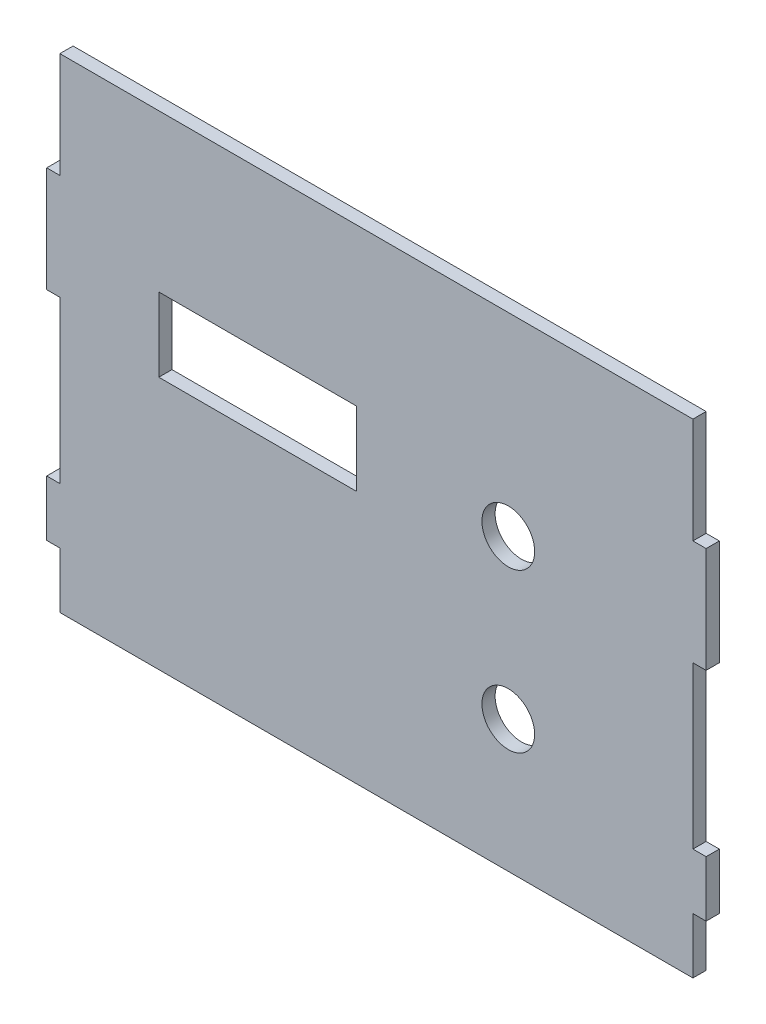
ISO-10303-21;
HEADER;
FILE_DESCRIPTION(('STEP AP214'),'2;1');
FILE_NAME('part.step','',(''),(''),'','','');
FILE_SCHEMA(('AUTOMOTIVE_DESIGN { 1 0 10303 214 1 1 1 1 }'));
ENDSEC;
DATA;
#1=APPLICATION_CONTEXT('core data for automotive mechanical design processes');
#2=APPLICATION_PROTOCOL_DEFINITION('international standard','automotive_design',2000,#1);
#3=PRODUCT_CONTEXT('',#1,'mechanical');
#4=PRODUCT('Part','Part','',(#3));
#5=PRODUCT_RELATED_PRODUCT_CATEGORY('part','',(#4));
#6=PRODUCT_DEFINITION_FORMATION('','',#4);
#7=PRODUCT_DEFINITION_CONTEXT('part definition',#1,'design');
#8=PRODUCT_DEFINITION('design','',#6,#7);
#9=PRODUCT_DEFINITION_SHAPE('','',#8);
#10=(LENGTH_UNIT() NAMED_UNIT(*) SI_UNIT(.MILLI.,.METRE.));
#11=(NAMED_UNIT(*) PLANE_ANGLE_UNIT() SI_UNIT($,.RADIAN.));
#12=(NAMED_UNIT(*) SI_UNIT($,.STERADIAN.) SOLID_ANGLE_UNIT());
#13=UNCERTAINTY_MEASURE_WITH_UNIT(LENGTH_MEASURE(1.E-05),#10,'distance_accuracy_value','');
#14=(GEOMETRIC_REPRESENTATION_CONTEXT(3) GLOBAL_UNCERTAINTY_ASSIGNED_CONTEXT((#13)) GLOBAL_UNIT_ASSIGNED_CONTEXT((#10,
#11,#12)) REPRESENTATION_CONTEXT('',''));
#15=CARTESIAN_POINT('',(0.,0.,0.));
#16=DIRECTION('',(0.,0.,1.));
#17=DIRECTION('',(1.,0.,0.));
#18=AXIS2_PLACEMENT_3D('',#15,#16,#17);
#19=CARTESIAN_POINT('',(0.,0.,5.));
#20=DIRECTION('',(0.,0.,1.));
#21=DIRECTION('',(1.,0.,0.));
#22=AXIS2_PLACEMENT_3D('',#19,#20,#21);
#23=PLANE('',#22);
#24=CARTESIAN_POINT('',(170.,110.,5.));
#25=DIRECTION('',(0.,0.,1.));
#26=DIRECTION('',(1.,0.,0.));
#27=AXIS2_PLACEMENT_3D('',#24,#25,#26);
#28=CIRCLE('',#27,10.);
#29=CARTESIAN_POINT('',(180.,110.,5.));
#30=VERTEX_POINT('',#29);
#31=EDGE_CURVE('E235',#30,#30,#28,.T.);
#32=ORIENTED_EDGE('',*,*,#31,.F.);
#33=EDGE_LOOP('',(#32));
#34=FACE_BOUND('',#33,.T.);
#35=DIRECTION('',(0.,-1.,0.));
#36=VECTOR('',#35,1.);
#37=CARTESIAN_POINT('',(0.,0.,5.));
#38=LINE('',#37,#36);
#39=CARTESIAN_POINT('',(0.,21.1666666666667,5.));
#40=VERTEX_POINT('',#39);
#41=CARTESIAN_POINT('',(0.,0.,5.));
#42=VERTEX_POINT('',#41);
#43=EDGE_CURVE('E251',#40,#42,#38,.T.);
#44=ORIENTED_EDGE('',*,*,#43,.T.);
#45=DIRECTION('',(1.,0.,0.));
#46=VECTOR('',#45,1.);
#47=CARTESIAN_POINT('',(0.,0.,5.));
#48=LINE('',#47,#46);
#49=CARTESIAN_POINT('',(240.,0.,5.));
#50=VERTEX_POINT('',#49);
#51=EDGE_CURVE('E255',#42,#50,#48,.T.);
#52=ORIENTED_EDGE('',*,*,#51,.T.);
#53=DIRECTION('',(0.,1.,0.));
#54=VECTOR('',#53,1.);
#55=CARTESIAN_POINT('',(240.,0.,5.));
#56=LINE('',#55,#54);
#57=CARTESIAN_POINT('',(240.,21.1666666666667,5.));
#58=VERTEX_POINT('',#57);
#59=EDGE_CURVE('E259',#50,#58,#56,.T.);
#60=ORIENTED_EDGE('',*,*,#59,.T.);
#61=DIRECTION('',(1.,0.,0.));
#62=VECTOR('',#61,1.);
#63=CARTESIAN_POINT('',(240.,21.1666666666667,5.));
#64=LINE('',#63,#62);
#65=CARTESIAN_POINT('',(245.,21.1666666666667,5.));
#66=VERTEX_POINT('',#65);
#67=EDGE_CURVE('E262',#58,#66,#64,.T.);
#68=ORIENTED_EDGE('',*,*,#67,.T.);
#69=DIRECTION('',(0.,1.,0.));
#70=VECTOR('',#69,1.);
#71=CARTESIAN_POINT('',(245.,42.3333333333334,5.));
#72=LINE('',#71,#70);
#73=CARTESIAN_POINT('',(245.,42.3333333333334,5.));
#74=VERTEX_POINT('',#73);
#75=EDGE_CURVE('E265',#66,#74,#72,.T.);
#76=ORIENTED_EDGE('',*,*,#75,.T.);
#77=DIRECTION('',(-1.,0.,0.));
#78=VECTOR('',#77,1.);
#79=CARTESIAN_POINT('',(240.,42.3333333333334,5.));
#80=LINE('',#79,#78);
#81=CARTESIAN_POINT('',(240.,42.3333333333334,5.));
#82=VERTEX_POINT('',#81);
#83=EDGE_CURVE('E268',#74,#82,#80,.T.);
#84=ORIENTED_EDGE('',*,*,#83,.T.);
#85=DIRECTION('',(0.,1.,0.));
#86=VECTOR('',#85,1.);
#87=CARTESIAN_POINT('',(240.,42.3333333333334,5.));
#88=LINE('',#87,#86);
#89=CARTESIAN_POINT('',(240.,103.5,5.));
#90=VERTEX_POINT('',#89);
#91=EDGE_CURVE('E271',#82,#90,#88,.T.);
#92=ORIENTED_EDGE('',*,*,#91,.T.);
#93=DIRECTION('',(1.,0.,0.));
#94=VECTOR('',#93,1.);
#95=CARTESIAN_POINT('',(240.,103.5,5.));
#96=LINE('',#95,#94);
#97=CARTESIAN_POINT('',(245.,103.5,5.));
#98=VERTEX_POINT('',#97);
#99=EDGE_CURVE('E274',#90,#98,#96,.T.);
#100=ORIENTED_EDGE('',*,*,#99,.T.);
#101=DIRECTION('',(0.,1.,0.));
#102=VECTOR('',#101,1.);
#103=CARTESIAN_POINT('',(245.,143.5,5.));
#104=LINE('',#103,#102);
#105=CARTESIAN_POINT('',(245.,143.5,5.));
#106=VERTEX_POINT('',#105);
#107=EDGE_CURVE('E277',#98,#106,#104,.T.);
#108=ORIENTED_EDGE('',*,*,#107,.T.);
#109=DIRECTION('',(-1.,0.,0.));
#110=VECTOR('',#109,1.);
#111=CARTESIAN_POINT('',(240.,143.5,5.));
#112=LINE('',#111,#110);
#113=CARTESIAN_POINT('',(240.,143.5,5.));
#114=VERTEX_POINT('',#113);
#115=EDGE_CURVE('E280',#106,#114,#112,.T.);
#116=ORIENTED_EDGE('',*,*,#115,.T.);
#117=DIRECTION('',(0.,1.,0.));
#118=VECTOR('',#117,1.);
#119=CARTESIAN_POINT('',(240.,143.5,5.));
#120=LINE('',#119,#118);
#121=CARTESIAN_POINT('',(240.,183.5,5.));
#122=VERTEX_POINT('',#121);
#123=EDGE_CURVE('E283',#114,#122,#120,.T.);
#124=ORIENTED_EDGE('',*,*,#123,.T.);
#125=DIRECTION('',(-1.,0.,0.));
#126=VECTOR('',#125,1.);
#127=CARTESIAN_POINT('',(0.,183.5,5.));
#128=LINE('',#127,#126);
#129=CARTESIAN_POINT('',(0.,183.5,5.));
#130=VERTEX_POINT('',#129);
#131=EDGE_CURVE('E286',#122,#130,#128,.T.);
#132=ORIENTED_EDGE('',*,*,#131,.T.);
#133=DIRECTION('',(0.,-1.,0.));
#134=VECTOR('',#133,1.);
#135=CARTESIAN_POINT('',(0.,143.5,5.));
#136=LINE('',#135,#134);
#137=CARTESIAN_POINT('',(0.,143.5,5.));
#138=VERTEX_POINT('',#137);
#139=EDGE_CURVE('E289',#130,#138,#136,.T.);
#140=ORIENTED_EDGE('',*,*,#139,.T.);
#141=DIRECTION('',(-1.,0.,0.));
#142=VECTOR('',#141,1.);
#143=CARTESIAN_POINT('',(0.,143.5,5.));
#144=LINE('',#143,#142);
#145=CARTESIAN_POINT('',(-5.00000000000004,143.5,5.));
#146=VERTEX_POINT('',#145);
#147=EDGE_CURVE('E292',#138,#146,#144,.T.);
#148=ORIENTED_EDGE('',*,*,#147,.T.);
#149=DIRECTION('',(0.,-1.,0.));
#150=VECTOR('',#149,1.);
#151=CARTESIAN_POINT('',(-5.00000000000004,143.5,5.));
#152=LINE('',#151,#150);
#153=CARTESIAN_POINT('',(-5.00000000000003,103.5,5.));
#154=VERTEX_POINT('',#153);
#155=EDGE_CURVE('E295',#146,#154,#152,.T.);
#156=ORIENTED_EDGE('',*,*,#155,.T.);
#157=DIRECTION('',(1.,0.,0.));
#158=VECTOR('',#157,1.);
#159=CARTESIAN_POINT('',(0.,103.5,5.));
#160=LINE('',#159,#158);
#161=CARTESIAN_POINT('',(0.,103.5,5.));
#162=VERTEX_POINT('',#161);
#163=EDGE_CURVE('E298',#154,#162,#160,.T.);
#164=ORIENTED_EDGE('',*,*,#163,.T.);
#165=DIRECTION('',(0.,-1.,0.));
#166=VECTOR('',#165,1.);
#167=CARTESIAN_POINT('',(0.,42.3333333333333,5.));
#168=LINE('',#167,#166);
#169=CARTESIAN_POINT('',(0.,42.3333333333333,5.));
#170=VERTEX_POINT('',#169);
#171=EDGE_CURVE('E301',#162,#170,#168,.T.);
#172=ORIENTED_EDGE('',*,*,#171,.T.);
#173=DIRECTION('',(-1.,0.,0.));
#174=VECTOR('',#173,1.);
#175=CARTESIAN_POINT('',(0.,42.3333333333333,5.));
#176=LINE('',#175,#174);
#177=CARTESIAN_POINT('',(-5.00000000000002,42.3333333333333,5.));
#178=VERTEX_POINT('',#177);
#179=EDGE_CURVE('E304',#170,#178,#176,.T.);
#180=ORIENTED_EDGE('',*,*,#179,.T.);
#181=DIRECTION('',(0.,-1.,0.));
#182=VECTOR('',#181,1.);
#183=CARTESIAN_POINT('',(-5.00000000000002,42.3333333333333,5.));
#184=LINE('',#183,#182);
#185=CARTESIAN_POINT('',(-5.00000000000002,21.1666666666667,5.));
#186=VERTEX_POINT('',#185);
#187=EDGE_CURVE('E307',#178,#186,#184,.T.);
#188=ORIENTED_EDGE('',*,*,#187,.T.);
#189=DIRECTION('',(1.,0.,0.));
#190=VECTOR('',#189,1.);
#191=CARTESIAN_POINT('',(0.,21.1666666666667,5.));
#192=LINE('',#191,#190);
#193=EDGE_CURVE('E310',#186,#40,#192,.T.);
#194=ORIENTED_EDGE('',*,*,#193,.T.);
#195=EDGE_LOOP('',(#44,#52,#60,#68,#76,#84,#92,#100,#108,#116,#124,#132,#140,#148,#156,#164,
#172,#180,#188,#194));
#196=FACE_BOUND('',#195,.T.);
#197=DIRECTION('',(1.,0.,0.));
#198=VECTOR('',#197,1.);
#199=CARTESIAN_POINT('',(37.5,96.,5.));
#200=LINE('',#199,#198);
#201=CARTESIAN_POINT('',(37.5,96.,5.));
#202=VERTEX_POINT('',#201);
#203=CARTESIAN_POINT('',(112.5,96.,5.));
#204=VERTEX_POINT('',#203);
#205=EDGE_CURVE('E209',#202,#204,#200,.T.);
#206=ORIENTED_EDGE('',*,*,#205,.F.);
#207=DIRECTION('',(0.,-1.,0.));
#208=VECTOR('',#207,1.);
#209=CARTESIAN_POINT('',(37.5,124.,5.));
#210=LINE('',#209,#208);
#211=CARTESIAN_POINT('',(37.5,124.,5.));
#212=VERTEX_POINT('',#211);
#213=EDGE_CURVE('E200',#212,#202,#210,.T.);
#214=ORIENTED_EDGE('',*,*,#213,.F.);
#215=DIRECTION('',(-1.,0.,0.));
#216=VECTOR('',#215,1.);
#217=CARTESIAN_POINT('',(37.5,124.,5.));
#218=LINE('',#217,#216);
#219=CARTESIAN_POINT('',(112.5,124.,5.));
#220=VERTEX_POINT('',#219);
#221=EDGE_CURVE('E227',#220,#212,#218,.T.);
#222=ORIENTED_EDGE('',*,*,#221,.F.);
#223=DIRECTION('',(0.,1.,0.));
#224=VECTOR('',#223,1.);
#225=CARTESIAN_POINT('',(112.5,124.,5.));
#226=LINE('',#225,#224);
#227=EDGE_CURVE('E223',#204,#220,#226,.T.);
#228=ORIENTED_EDGE('',*,*,#227,.F.);
#229=EDGE_LOOP('',(#206,#214,#222,#228));
#230=FACE_BOUND('',#229,.T.);
#231=CARTESIAN_POINT('',(170.,50.,5.));
#232=DIRECTION('',(0.,0.,1.));
#233=DIRECTION('',(1.,0.,0.));
#234=AXIS2_PLACEMENT_3D('',#231,#232,#233);
#235=CIRCLE('',#234,10.);
#236=CARTESIAN_POINT('',(180.,50.,5.));
#237=VERTEX_POINT('',#236);
#238=EDGE_CURVE('E780',#237,#237,#235,.T.);
#239=ORIENTED_EDGE('',*,*,#238,.F.);
#240=EDGE_LOOP('',(#239));
#241=FACE_BOUND('',#240,.T.);
#242=ADVANCED_FACE('F38',(#34,#196,#230,#241),#23,.T.);
#243=CARTESIAN_POINT('',(0.,0.,0.));
#244=DIRECTION('',(0.,0.,1.));
#245=DIRECTION('',(1.,0.,0.));
#246=AXIS2_PLACEMENT_3D('',#243,#244,#245);
#247=PLANE('',#246);
#248=DIRECTION('',(0.,-1.,0.));
#249=VECTOR('',#248,1.);
#250=CARTESIAN_POINT('',(0.,0.,0.));
#251=LINE('',#250,#249);
#252=CARTESIAN_POINT('',(0.,21.1666666666667,0.));
#253=VERTEX_POINT('',#252);
#254=CARTESIAN_POINT('',(0.,0.,0.));
#255=VERTEX_POINT('',#254);
#256=EDGE_CURVE('E218',#253,#255,#251,.T.);
#257=ORIENTED_EDGE('',*,*,#256,.F.);
#258=DIRECTION('',(1.,0.,0.));
#259=VECTOR('',#258,1.);
#260=CARTESIAN_POINT('',(0.,21.1666666666667,0.));
#261=LINE('',#260,#259);
#262=CARTESIAN_POINT('',(-5.00000000000002,21.1666666666667,0.));
#263=VERTEX_POINT('',#262);
#264=EDGE_CURVE('E256',#263,#253,#261,.T.);
#265=ORIENTED_EDGE('',*,*,#264,.F.);
#266=DIRECTION('',(0.,-1.,0.));
#267=VECTOR('',#266,1.);
#268=CARTESIAN_POINT('',(-5.00000000000002,42.3333333333333,0.));
#269=LINE('',#268,#267);
#270=CARTESIAN_POINT('',(-5.00000000000002,42.3333333333333,0.));
#271=VERTEX_POINT('',#270);
#272=EDGE_CURVE('E368',#271,#263,#269,.T.);
#273=ORIENTED_EDGE('',*,*,#272,.F.);
#274=DIRECTION('',(-1.,0.,0.));
#275=VECTOR('',#274,1.);
#276=CARTESIAN_POINT('',(0.,42.3333333333333,0.));
#277=LINE('',#276,#275);
#278=CARTESIAN_POINT('',(0.,42.3333333333333,0.));
#279=VERTEX_POINT('',#278);
#280=EDGE_CURVE('E365',#279,#271,#277,.T.);
#281=ORIENTED_EDGE('',*,*,#280,.F.);
#282=DIRECTION('',(0.,-1.,0.));
#283=VECTOR('',#282,1.);
#284=CARTESIAN_POINT('',(0.,42.3333333333333,0.));
#285=LINE('',#284,#283);
#286=CARTESIAN_POINT('',(0.,103.5,0.));
#287=VERTEX_POINT('',#286);
#288=EDGE_CURVE('E362',#287,#279,#285,.T.);
#289=ORIENTED_EDGE('',*,*,#288,.F.);
#290=DIRECTION('',(1.,0.,0.));
#291=VECTOR('',#290,1.);
#292=CARTESIAN_POINT('',(0.,103.5,0.));
#293=LINE('',#292,#291);
#294=CARTESIAN_POINT('',(-5.00000000000003,103.5,0.));
#295=VERTEX_POINT('',#294);
#296=EDGE_CURVE('E359',#295,#287,#293,.T.);
#297=ORIENTED_EDGE('',*,*,#296,.F.);
#298=DIRECTION('',(0.,-1.,0.));
#299=VECTOR('',#298,1.);
#300=CARTESIAN_POINT('',(-5.00000000000004,143.5,0.));
#301=LINE('',#300,#299);
#302=CARTESIAN_POINT('',(-5.00000000000004,143.5,0.));
#303=VERTEX_POINT('',#302);
#304=EDGE_CURVE('E356',#303,#295,#301,.T.);
#305=ORIENTED_EDGE('',*,*,#304,.F.);
#306=DIRECTION('',(-1.,0.,0.));
#307=VECTOR('',#306,1.);
#308=CARTESIAN_POINT('',(0.,143.5,0.));
#309=LINE('',#308,#307);
#310=CARTESIAN_POINT('',(0.,143.5,0.));
#311=VERTEX_POINT('',#310);
#312=EDGE_CURVE('E353',#311,#303,#309,.T.);
#313=ORIENTED_EDGE('',*,*,#312,.F.);
#314=DIRECTION('',(0.,-1.,0.));
#315=VECTOR('',#314,1.);
#316=CARTESIAN_POINT('',(0.,143.5,0.));
#317=LINE('',#316,#315);
#318=CARTESIAN_POINT('',(0.,183.5,0.));
#319=VERTEX_POINT('',#318);
#320=EDGE_CURVE('E350',#319,#311,#317,.T.);
#321=ORIENTED_EDGE('',*,*,#320,.F.);
#322=DIRECTION('',(-1.,0.,0.));
#323=VECTOR('',#322,1.);
#324=CARTESIAN_POINT('',(0.,183.5,0.));
#325=LINE('',#324,#323);
#326=CARTESIAN_POINT('',(240.,183.5,0.));
#327=VERTEX_POINT('',#326);
#328=EDGE_CURVE('E347',#327,#319,#325,.T.);
#329=ORIENTED_EDGE('',*,*,#328,.F.);
#330=DIRECTION('',(0.,1.,0.));
#331=VECTOR('',#330,1.);
#332=CARTESIAN_POINT('',(240.,143.5,0.));
#333=LINE('',#332,#331);
#334=CARTESIAN_POINT('',(240.,143.5,0.));
#335=VERTEX_POINT('',#334);
#336=EDGE_CURVE('E344',#335,#327,#333,.T.);
#337=ORIENTED_EDGE('',*,*,#336,.F.);
#338=DIRECTION('',(-1.,0.,0.));
#339=VECTOR('',#338,1.);
#340=CARTESIAN_POINT('',(240.,143.5,0.));
#341=LINE('',#340,#339);
#342=CARTESIAN_POINT('',(245.,143.5,0.));
#343=VERTEX_POINT('',#342);
#344=EDGE_CURVE('E341',#343,#335,#341,.T.);
#345=ORIENTED_EDGE('',*,*,#344,.F.);
#346=DIRECTION('',(0.,1.,0.));
#347=VECTOR('',#346,1.);
#348=CARTESIAN_POINT('',(245.,143.5,0.));
#349=LINE('',#348,#347);
#350=CARTESIAN_POINT('',(245.,103.5,0.));
#351=VERTEX_POINT('',#350);
#352=EDGE_CURVE('E338',#351,#343,#349,.T.);
#353=ORIENTED_EDGE('',*,*,#352,.F.);
#354=DIRECTION('',(1.,0.,0.));
#355=VECTOR('',#354,1.);
#356=CARTESIAN_POINT('',(240.,103.5,0.));
#357=LINE('',#356,#355);
#358=CARTESIAN_POINT('',(240.,103.5,0.));
#359=VERTEX_POINT('',#358);
#360=EDGE_CURVE('E335',#359,#351,#357,.T.);
#361=ORIENTED_EDGE('',*,*,#360,.F.);
#362=DIRECTION('',(0.,1.,0.));
#363=VECTOR('',#362,1.);
#364=CARTESIAN_POINT('',(240.,42.3333333333334,0.));
#365=LINE('',#364,#363);
#366=CARTESIAN_POINT('',(240.,42.3333333333334,0.));
#367=VERTEX_POINT('',#366);
#368=EDGE_CURVE('E332',#367,#359,#365,.T.);
#369=ORIENTED_EDGE('',*,*,#368,.F.);
#370=DIRECTION('',(-1.,0.,0.));
#371=VECTOR('',#370,1.);
#372=CARTESIAN_POINT('',(240.,42.3333333333334,0.));
#373=LINE('',#372,#371);
#374=CARTESIAN_POINT('',(245.,42.3333333333334,0.));
#375=VERTEX_POINT('',#374);
#376=EDGE_CURVE('E329',#375,#367,#373,.T.);
#377=ORIENTED_EDGE('',*,*,#376,.F.);
#378=DIRECTION('',(0.,1.,0.));
#379=VECTOR('',#378,1.);
#380=CARTESIAN_POINT('',(245.,42.3333333333334,0.));
#381=LINE('',#380,#379);
#382=CARTESIAN_POINT('',(245.,21.1666666666667,0.));
#383=VERTEX_POINT('',#382);
#384=EDGE_CURVE('E326',#383,#375,#381,.T.);
#385=ORIENTED_EDGE('',*,*,#384,.F.);
#386=DIRECTION('',(1.,0.,0.));
#387=VECTOR('',#386,1.);
#388=CARTESIAN_POINT('',(240.,21.1666666666667,0.));
#389=LINE('',#388,#387);
#390=CARTESIAN_POINT('',(240.,21.1666666666667,0.));
#391=VERTEX_POINT('',#390);
#392=EDGE_CURVE('E323',#391,#383,#389,.T.);
#393=ORIENTED_EDGE('',*,*,#392,.F.);
#394=DIRECTION('',(0.,1.,0.));
#395=VECTOR('',#394,1.);
#396=CARTESIAN_POINT('',(240.,0.,0.));
#397=LINE('',#396,#395);
#398=CARTESIAN_POINT('',(240.,0.,0.));
#399=VERTEX_POINT('',#398);
#400=EDGE_CURVE('E320',#399,#391,#397,.T.);
#401=ORIENTED_EDGE('',*,*,#400,.F.);
#402=DIRECTION('',(1.,0.,0.));
#403=VECTOR('',#402,1.);
#404=CARTESIAN_POINT('',(0.,0.,0.));
#405=LINE('',#404,#403);
#406=EDGE_CURVE('E317',#255,#399,#405,.T.);
#407=ORIENTED_EDGE('',*,*,#406,.F.);
#408=EDGE_LOOP('',(#257,#265,#273,#281,#289,#297,#305,#313,#321,#329,#337,#345,#353,#361,#369,
#377,#385,#393,#401,#407));
#409=FACE_BOUND('',#408,.T.);
#410=DIRECTION('',(0.,-1.,0.));
#411=VECTOR('',#410,1.);
#412=CARTESIAN_POINT('',(37.5,124.,0.));
#413=LINE('',#412,#411);
#414=CARTESIAN_POINT('',(37.5,124.,0.));
#415=VERTEX_POINT('',#414);
#416=CARTESIAN_POINT('',(37.5,96.,0.));
#417=VERTEX_POINT('',#416);
#418=EDGE_CURVE('E62',#415,#417,#413,.T.);
#419=ORIENTED_EDGE('',*,*,#418,.T.);
#420=DIRECTION('',(1.,0.,0.));
#421=VECTOR('',#420,1.);
#422=CARTESIAN_POINT('',(37.5,96.,0.));
#423=LINE('',#422,#421);
#424=CARTESIAN_POINT('',(112.5,96.,0.));
#425=VERTEX_POINT('',#424);
#426=EDGE_CURVE('E216',#417,#425,#423,.T.);
#427=ORIENTED_EDGE('',*,*,#426,.T.);
#428=DIRECTION('',(0.,1.,0.));
#429=VECTOR('',#428,1.);
#430=CARTESIAN_POINT('',(112.5,124.,0.));
#431=LINE('',#430,#429);
#432=CARTESIAN_POINT('',(112.5,124.,0.));
#433=VERTEX_POINT('',#432);
#434=EDGE_CURVE('E238',#425,#433,#431,.T.);
#435=ORIENTED_EDGE('',*,*,#434,.T.);
#436=DIRECTION('',(-1.,0.,0.));
#437=VECTOR('',#436,1.);
#438=CARTESIAN_POINT('',(37.5,124.,0.));
#439=LINE('',#438,#437);
#440=EDGE_CURVE('E210',#433,#415,#439,.T.);
#441=ORIENTED_EDGE('',*,*,#440,.T.);
#442=EDGE_LOOP('',(#419,#427,#435,#441));
#443=FACE_BOUND('',#442,.T.);
#444=CARTESIAN_POINT('',(170.,110.,0.));
#445=DIRECTION('',(0.,0.,1.));
#446=DIRECTION('',(1.,0.,0.));
#447=AXIS2_PLACEMENT_3D('',#444,#445,#446);
#448=CIRCLE('',#447,10.);
#449=CARTESIAN_POINT('',(180.,110.,0.));
#450=VERTEX_POINT('',#449);
#451=EDGE_CURVE('E788',#450,#450,#448,.T.);
#452=ORIENTED_EDGE('',*,*,#451,.T.);
#453=EDGE_LOOP('',(#452));
#454=FACE_BOUND('',#453,.T.);
#455=CARTESIAN_POINT('',(170.,50.,0.));
#456=DIRECTION('',(0.,0.,1.));
#457=DIRECTION('',(1.,0.,0.));
#458=AXIS2_PLACEMENT_3D('',#455,#456,#457);
#459=CIRCLE('',#458,10.);
#460=CARTESIAN_POINT('',(180.,50.,0.));
#461=VERTEX_POINT('',#460);
#462=EDGE_CURVE('E783',#461,#461,#459,.T.);
#463=ORIENTED_EDGE('',*,*,#462,.T.);
#464=EDGE_LOOP('',(#463));
#465=FACE_BOUND('',#464,.T.);
#466=ADVANCED_FACE('F455',(#409,#443,#454,#465),#247,.F.);
#467=CARTESIAN_POINT('',(0.,0.,5.));
#468=DIRECTION('',(1.,0.,0.));
#469=DIRECTION('',(0.,1.,0.));
#470=AXIS2_PLACEMENT_3D('',#467,#468,#469);
#471=PLANE('',#470);
#472=ORIENTED_EDGE('',*,*,#256,.T.);
#473=DIRECTION('',(0.,0.,-1.));
#474=VECTOR('',#473,1.);
#475=CARTESIAN_POINT('',(0.,0.,5.));
#476=LINE('',#475,#474);
#477=EDGE_CURVE('E11',#42,#255,#476,.T.);
#478=ORIENTED_EDGE('',*,*,#477,.F.);
#479=ORIENTED_EDGE('',*,*,#43,.F.);
#480=DIRECTION('',(0.,0.,-1.));
#481=VECTOR('',#480,1.);
#482=CARTESIAN_POINT('',(0.,21.1666666666667,5.));
#483=LINE('',#482,#481);
#484=EDGE_CURVE('E313',#40,#253,#483,.T.);
#485=ORIENTED_EDGE('',*,*,#484,.T.);
#486=EDGE_LOOP('',(#472,#478,#479,#485));
#487=FACE_BOUND('',#486,.T.);
#488=ADVANCED_FACE('F40',(#487),#471,.F.);
#489=CARTESIAN_POINT('',(0.,0.,5.));
#490=DIRECTION('',(0.,1.,0.));
#491=DIRECTION('',(0.,0.,1.));
#492=AXIS2_PLACEMENT_3D('',#489,#490,#491);
#493=PLANE('',#492);
#494=ORIENTED_EDGE('',*,*,#406,.T.);
#495=DIRECTION('',(0.,0.,-1.));
#496=VECTOR('',#495,1.);
#497=CARTESIAN_POINT('',(240.,0.,5.));
#498=LINE('',#497,#496);
#499=EDGE_CURVE('E47',#50,#399,#498,.T.);
#500=ORIENTED_EDGE('',*,*,#499,.F.);
#501=ORIENTED_EDGE('',*,*,#51,.F.);
#502=ORIENTED_EDGE('',*,*,#477,.T.);
#503=EDGE_LOOP('',(#494,#500,#501,#502));
#504=FACE_BOUND('',#503,.T.);
#505=ADVANCED_FACE('F472',(#504),#493,.F.);
#506=CARTESIAN_POINT('',(240.,0.,5.));
#507=DIRECTION('',(-1.,0.,0.));
#508=DIRECTION('',(0.,0.,1.));
#509=AXIS2_PLACEMENT_3D('',#506,#507,#508);
#510=PLANE('',#509);
#511=ORIENTED_EDGE('',*,*,#400,.T.);
#512=DIRECTION('',(0.,0.,-1.));
#513=VECTOR('',#512,1.);
#514=CARTESIAN_POINT('',(240.,21.1666666666667,5.));
#515=LINE('',#514,#513);
#516=EDGE_CURVE('E440',#58,#391,#515,.T.);
#517=ORIENTED_EDGE('',*,*,#516,.F.);
#518=ORIENTED_EDGE('',*,*,#59,.F.);
#519=ORIENTED_EDGE('',*,*,#499,.T.);
#520=EDGE_LOOP('',(#511,#517,#518,#519));
#521=FACE_BOUND('',#520,.T.);
#522=ADVANCED_FACE('F449',(#521),#510,.F.);
#523=CARTESIAN_POINT('',(240.,21.1666666666667,5.));
#524=DIRECTION('',(0.,1.,0.));
#525=DIRECTION('',(0.,0.,1.));
#526=AXIS2_PLACEMENT_3D('',#523,#524,#525);
#527=PLANE('',#526);
#528=ORIENTED_EDGE('',*,*,#392,.T.);
#529=DIRECTION('',(0.,0.,-1.));
#530=VECTOR('',#529,1.);
#531=CARTESIAN_POINT('',(245.,21.1666666666667,5.));
#532=LINE('',#531,#530);
#533=EDGE_CURVE('E436',#66,#383,#532,.T.);
#534=ORIENTED_EDGE('',*,*,#533,.F.);
#535=ORIENTED_EDGE('',*,*,#67,.F.);
#536=ORIENTED_EDGE('',*,*,#516,.T.);
#537=EDGE_LOOP('',(#528,#534,#535,#536));
#538=FACE_BOUND('',#537,.T.);
#539=ADVANCED_FACE('F461',(#538),#527,.F.);
#540=CARTESIAN_POINT('',(245.,42.3333333333334,5.));
#541=DIRECTION('',(-1.,0.,0.));
#542=DIRECTION('',(0.,0.,1.));
#543=AXIS2_PLACEMENT_3D('',#540,#541,#542);
#544=PLANE('',#543);
#545=ORIENTED_EDGE('',*,*,#384,.T.);
#546=DIRECTION('',(0.,0.,-1.));
#547=VECTOR('',#546,1.);
#548=CARTESIAN_POINT('',(245.,42.3333333333334,5.));
#549=LINE('',#548,#547);
#550=EDGE_CURVE('E432',#74,#375,#549,.T.);
#551=ORIENTED_EDGE('',*,*,#550,.F.);
#552=ORIENTED_EDGE('',*,*,#75,.F.);
#553=ORIENTED_EDGE('',*,*,#533,.T.);
#554=EDGE_LOOP('',(#545,#551,#552,#553));
#555=FACE_BOUND('',#554,.T.);
#556=ADVANCED_FACE('F465',(#555),#544,.F.);
#557=CARTESIAN_POINT('',(240.,42.3333333333334,5.));
#558=DIRECTION('',(0.,-1.,0.));
#559=DIRECTION('',(0.,0.,-1.));
#560=AXIS2_PLACEMENT_3D('',#557,#558,#559);
#561=PLANE('',#560);
#562=ORIENTED_EDGE('',*,*,#376,.T.);
#563=DIRECTION('',(0.,0.,-1.));
#564=VECTOR('',#563,1.);
#565=CARTESIAN_POINT('',(240.,42.3333333333334,5.));
#566=LINE('',#565,#564);
#567=EDGE_CURVE('E428',#82,#367,#566,.T.);
#568=ORIENTED_EDGE('',*,*,#567,.F.);
#569=ORIENTED_EDGE('',*,*,#83,.F.);
#570=ORIENTED_EDGE('',*,*,#550,.T.);
#571=EDGE_LOOP('',(#562,#568,#569,#570));
#572=FACE_BOUND('',#571,.T.);
#573=ADVANCED_FACE('F545',(#572),#561,.F.);
#574=CARTESIAN_POINT('',(240.,42.3333333333334,5.));
#575=DIRECTION('',(-1.,0.,0.));
#576=DIRECTION('',(0.,-1.,0.));
#577=AXIS2_PLACEMENT_3D('',#574,#575,#576);
#578=PLANE('',#577);
#579=ORIENTED_EDGE('',*,*,#368,.T.);
#580=DIRECTION('',(0.,0.,-1.));
#581=VECTOR('',#580,1.);
#582=CARTESIAN_POINT('',(240.,103.5,5.));
#583=LINE('',#582,#581);
#584=EDGE_CURVE('E424',#90,#359,#583,.T.);
#585=ORIENTED_EDGE('',*,*,#584,.F.);
#586=ORIENTED_EDGE('',*,*,#91,.F.);
#587=ORIENTED_EDGE('',*,*,#567,.T.);
#588=EDGE_LOOP('',(#579,#585,#586,#587));
#589=FACE_BOUND('',#588,.T.);
#590=ADVANCED_FACE('F543',(#589),#578,.F.);
#591=CARTESIAN_POINT('',(240.,103.5,5.));
#592=DIRECTION('',(0.,1.,0.));
#593=DIRECTION('',(0.,0.,1.));
#594=AXIS2_PLACEMENT_3D('',#591,#592,#593);
#595=PLANE('',#594);
#596=ORIENTED_EDGE('',*,*,#360,.T.);
#597=DIRECTION('',(0.,0.,-1.));
#598=VECTOR('',#597,1.);
#599=CARTESIAN_POINT('',(245.,103.5,5.));
#600=LINE('',#599,#598);
#601=EDGE_CURVE('E420',#98,#351,#600,.T.);
#602=ORIENTED_EDGE('',*,*,#601,.F.);
#603=ORIENTED_EDGE('',*,*,#99,.F.);
#604=ORIENTED_EDGE('',*,*,#584,.T.);
#605=EDGE_LOOP('',(#596,#602,#603,#604));
#606=FACE_BOUND('',#605,.T.);
#607=ADVANCED_FACE('F538',(#606),#595,.F.);
#608=CARTESIAN_POINT('',(245.,143.5,5.));
#609=DIRECTION('',(-1.,0.,0.));
#610=DIRECTION('',(0.,0.,1.));
#611=AXIS2_PLACEMENT_3D('',#608,#609,#610);
#612=PLANE('',#611);
#613=ORIENTED_EDGE('',*,*,#352,.T.);
#614=DIRECTION('',(0.,0.,-1.));
#615=VECTOR('',#614,1.);
#616=CARTESIAN_POINT('',(245.,143.5,5.));
#617=LINE('',#616,#615);
#618=EDGE_CURVE('E416',#106,#343,#617,.T.);
#619=ORIENTED_EDGE('',*,*,#618,.F.);
#620=ORIENTED_EDGE('',*,*,#107,.F.);
#621=ORIENTED_EDGE('',*,*,#601,.T.);
#622=EDGE_LOOP('',(#613,#619,#620,#621));
#623=FACE_BOUND('',#622,.T.);
#624=ADVANCED_FACE('F533',(#623),#612,.F.);
#625=CARTESIAN_POINT('',(240.,143.5,5.));
#626=DIRECTION('',(0.,-1.,0.));
#627=DIRECTION('',(0.,0.,-1.));
#628=AXIS2_PLACEMENT_3D('',#625,#626,#627);
#629=PLANE('',#628);
#630=ORIENTED_EDGE('',*,*,#344,.T.);
#631=DIRECTION('',(0.,0.,-1.));
#632=VECTOR('',#631,1.);
#633=CARTESIAN_POINT('',(240.,143.5,5.));
#634=LINE('',#633,#632);
#635=EDGE_CURVE('E412',#114,#335,#634,.T.);
#636=ORIENTED_EDGE('',*,*,#635,.F.);
#637=ORIENTED_EDGE('',*,*,#115,.F.);
#638=ORIENTED_EDGE('',*,*,#618,.T.);
#639=EDGE_LOOP('',(#630,#636,#637,#638));
#640=FACE_BOUND('',#639,.T.);
#641=ADVANCED_FACE('F529',(#640),#629,.F.);
#642=CARTESIAN_POINT('',(240.,143.5,5.));
#643=DIRECTION('',(-1.,0.,0.));
#644=DIRECTION('',(0.,0.,1.));
#645=AXIS2_PLACEMENT_3D('',#642,#643,#644);
#646=PLANE('',#645);
#647=ORIENTED_EDGE('',*,*,#336,.T.);
#648=DIRECTION('',(0.,0.,-1.));
#649=VECTOR('',#648,1.);
#650=CARTESIAN_POINT('',(240.,183.5,5.));
#651=LINE('',#650,#649);
#652=EDGE_CURVE('E408',#122,#327,#651,.T.);
#653=ORIENTED_EDGE('',*,*,#652,.F.);
#654=ORIENTED_EDGE('',*,*,#123,.F.);
#655=ORIENTED_EDGE('',*,*,#635,.T.);
#656=EDGE_LOOP('',(#647,#653,#654,#655));
#657=FACE_BOUND('',#656,.T.);
#658=ADVANCED_FACE('F524',(#657),#646,.F.);
#659=CARTESIAN_POINT('',(0.,183.5,5.));
#660=DIRECTION('',(0.,-1.,0.));
#661=DIRECTION('',(0.,0.,-1.));
#662=AXIS2_PLACEMENT_3D('',#659,#660,#661);
#663=PLANE('',#662);
#664=ORIENTED_EDGE('',*,*,#328,.T.);
#665=DIRECTION('',(0.,0.,-1.));
#666=VECTOR('',#665,1.);
#667=CARTESIAN_POINT('',(0.,183.5,5.));
#668=LINE('',#667,#666);
#669=EDGE_CURVE('E404',#130,#319,#668,.T.);
#670=ORIENTED_EDGE('',*,*,#669,.F.);
#671=ORIENTED_EDGE('',*,*,#131,.F.);
#672=ORIENTED_EDGE('',*,*,#652,.T.);
#673=EDGE_LOOP('',(#664,#670,#671,#672));
#674=FACE_BOUND('',#673,.T.);
#675=ADVANCED_FACE('F518',(#674),#663,.F.);
#676=CARTESIAN_POINT('',(0.,143.5,5.));
#677=DIRECTION('',(1.,0.,0.));
#678=DIRECTION('',(0.,1.,0.));
#679=AXIS2_PLACEMENT_3D('',#676,#677,#678);
#680=PLANE('',#679);
#681=ORIENTED_EDGE('',*,*,#320,.T.);
#682=DIRECTION('',(0.,0.,-1.));
#683=VECTOR('',#682,1.);
#684=CARTESIAN_POINT('',(0.,143.5,5.));
#685=LINE('',#684,#683);
#686=EDGE_CURVE('E400',#138,#311,#685,.T.);
#687=ORIENTED_EDGE('',*,*,#686,.F.);
#688=ORIENTED_EDGE('',*,*,#139,.F.);
#689=ORIENTED_EDGE('',*,*,#669,.T.);
#690=EDGE_LOOP('',(#681,#687,#688,#689));
#691=FACE_BOUND('',#690,.T.);
#692=ADVANCED_FACE('F514',(#691),#680,.F.);
#693=CARTESIAN_POINT('',(0.,143.5,5.));
#694=DIRECTION('',(0.,-1.,0.));
#695=DIRECTION('',(0.,0.,-1.));
#696=AXIS2_PLACEMENT_3D('',#693,#694,#695);
#697=PLANE('',#696);
#698=ORIENTED_EDGE('',*,*,#312,.T.);
#699=DIRECTION('',(0.,0.,-1.));
#700=VECTOR('',#699,1.);
#701=CARTESIAN_POINT('',(-5.00000000000004,143.5,5.));
#702=LINE('',#701,#700);
#703=EDGE_CURVE('E396',#146,#303,#702,.T.);
#704=ORIENTED_EDGE('',*,*,#703,.F.);
#705=ORIENTED_EDGE('',*,*,#147,.F.);
#706=ORIENTED_EDGE('',*,*,#686,.T.);
#707=EDGE_LOOP('',(#698,#704,#705,#706));
#708=FACE_BOUND('',#707,.T.);
#709=ADVANCED_FACE('F509',(#708),#697,.F.);
#710=CARTESIAN_POINT('',(-5.00000000000004,143.5,5.));
#711=DIRECTION('',(1.,0.,0.));
#712=DIRECTION('',(0.,1.,0.));
#713=AXIS2_PLACEMENT_3D('',#710,#711,#712);
#714=PLANE('',#713);
#715=ORIENTED_EDGE('',*,*,#304,.T.);
#716=DIRECTION('',(0.,0.,-1.));
#717=VECTOR('',#716,1.);
#718=CARTESIAN_POINT('',(-5.00000000000003,103.5,5.));
#719=LINE('',#718,#717);
#720=EDGE_CURVE('E392',#154,#295,#719,.T.);
#721=ORIENTED_EDGE('',*,*,#720,.F.);
#722=ORIENTED_EDGE('',*,*,#155,.F.);
#723=ORIENTED_EDGE('',*,*,#703,.T.);
#724=EDGE_LOOP('',(#715,#721,#722,#723));
#725=FACE_BOUND('',#724,.T.);
#726=ADVANCED_FACE('F503',(#725),#714,.F.);
#727=CARTESIAN_POINT('',(0.,103.5,5.));
#728=DIRECTION('',(0.,1.,0.));
#729=DIRECTION('',(0.,0.,1.));
#730=AXIS2_PLACEMENT_3D('',#727,#728,#729);
#731=PLANE('',#730);
#732=ORIENTED_EDGE('',*,*,#296,.T.);
#733=DIRECTION('',(0.,0.,-1.));
#734=VECTOR('',#733,1.);
#735=CARTESIAN_POINT('',(0.,103.5,5.));
#736=LINE('',#735,#734);
#737=EDGE_CURVE('E388',#162,#287,#736,.T.);
#738=ORIENTED_EDGE('',*,*,#737,.F.);
#739=ORIENTED_EDGE('',*,*,#163,.F.);
#740=ORIENTED_EDGE('',*,*,#720,.T.);
#741=EDGE_LOOP('',(#732,#738,#739,#740));
#742=FACE_BOUND('',#741,.T.);
#743=ADVANCED_FACE('F499',(#742),#731,.F.);
#744=CARTESIAN_POINT('',(0.,42.3333333333333,5.));
#745=DIRECTION('',(1.,0.,0.));
#746=DIRECTION('',(0.,1.,0.));
#747=AXIS2_PLACEMENT_3D('',#744,#745,#746);
#748=PLANE('',#747);
#749=ORIENTED_EDGE('',*,*,#288,.T.);
#750=DIRECTION('',(0.,0.,-1.));
#751=VECTOR('',#750,1.);
#752=CARTESIAN_POINT('',(0.,42.3333333333333,5.));
#753=LINE('',#752,#751);
#754=EDGE_CURVE('E384',#170,#279,#753,.T.);
#755=ORIENTED_EDGE('',*,*,#754,.F.);
#756=ORIENTED_EDGE('',*,*,#171,.F.);
#757=ORIENTED_EDGE('',*,*,#737,.T.);
#758=EDGE_LOOP('',(#749,#755,#756,#757));
#759=FACE_BOUND('',#758,.T.);
#760=ADVANCED_FACE('F494',(#759),#748,.F.);
#761=CARTESIAN_POINT('',(0.,42.3333333333333,5.));
#762=DIRECTION('',(0.,-1.,0.));
#763=DIRECTION('',(0.,0.,-1.));
#764=AXIS2_PLACEMENT_3D('',#761,#762,#763);
#765=PLANE('',#764);
#766=ORIENTED_EDGE('',*,*,#280,.T.);
#767=DIRECTION('',(0.,0.,-1.));
#768=VECTOR('',#767,1.);
#769=CARTESIAN_POINT('',(-5.00000000000002,42.3333333333333,5.));
#770=LINE('',#769,#768);
#771=EDGE_CURVE('E380',#178,#271,#770,.T.);
#772=ORIENTED_EDGE('',*,*,#771,.F.);
#773=ORIENTED_EDGE('',*,*,#179,.F.);
#774=ORIENTED_EDGE('',*,*,#754,.T.);
#775=EDGE_LOOP('',(#766,#772,#773,#774));
#776=FACE_BOUND('',#775,.T.);
#777=ADVANCED_FACE('F488',(#776),#765,.F.);
#778=CARTESIAN_POINT('',(-5.00000000000002,42.3333333333333,5.));
#779=DIRECTION('',(1.,0.,0.));
#780=DIRECTION('',(0.,1.,0.));
#781=AXIS2_PLACEMENT_3D('',#778,#779,#780);
#782=PLANE('',#781);
#783=ORIENTED_EDGE('',*,*,#272,.T.);
#784=DIRECTION('',(0.,0.,-1.));
#785=VECTOR('',#784,1.);
#786=CARTESIAN_POINT('',(-5.00000000000002,21.1666666666667,5.));
#787=LINE('',#786,#785);
#788=EDGE_CURVE('E376',#186,#263,#787,.T.);
#789=ORIENTED_EDGE('',*,*,#788,.F.);
#790=ORIENTED_EDGE('',*,*,#187,.F.);
#791=ORIENTED_EDGE('',*,*,#771,.T.);
#792=EDGE_LOOP('',(#783,#789,#790,#791));
#793=FACE_BOUND('',#792,.T.);
#794=ADVANCED_FACE('F484',(#793),#782,.F.);
#795=CARTESIAN_POINT('',(0.,21.1666666666667,5.));
#796=DIRECTION('',(0.,1.,0.));
#797=DIRECTION('',(0.,0.,1.));
#798=AXIS2_PLACEMENT_3D('',#795,#796,#797);
#799=PLANE('',#798);
#800=ORIENTED_EDGE('',*,*,#264,.T.);
#801=ORIENTED_EDGE('',*,*,#484,.F.);
#802=ORIENTED_EDGE('',*,*,#193,.F.);
#803=ORIENTED_EDGE('',*,*,#788,.T.);
#804=EDGE_LOOP('',(#800,#801,#802,#803));
#805=FACE_BOUND('',#804,.T.);
#806=ADVANCED_FACE('F479',(#805),#799,.F.);
#807=CARTESIAN_POINT('',(37.5,124.,5.));
#808=DIRECTION('',(1.,0.,0.));
#809=DIRECTION('',(0.,0.,-1.));
#810=AXIS2_PLACEMENT_3D('',#807,#808,#809);
#811=PLANE('',#810);
#812=ORIENTED_EDGE('',*,*,#418,.F.);
#813=DIRECTION('',(0.,0.,-1.));
#814=VECTOR('',#813,1.);
#815=CARTESIAN_POINT('',(37.5,124.,5.));
#816=LINE('',#815,#814);
#817=EDGE_CURVE('E204',#212,#415,#816,.T.);
#818=ORIENTED_EDGE('',*,*,#817,.F.);
#819=ORIENTED_EDGE('',*,*,#213,.T.);
#820=DIRECTION('',(0.,0.,-1.));
#821=VECTOR('',#820,1.);
#822=CARTESIAN_POINT('',(37.5,96.,5.));
#823=LINE('',#822,#821);
#824=EDGE_CURVE('E203',#202,#417,#823,.T.);
#825=ORIENTED_EDGE('',*,*,#824,.T.);
#826=EDGE_LOOP('',(#812,#818,#819,#825));
#827=FACE_BOUND('',#826,.T.);
#828=ADVANCED_FACE('F202',(#827),#811,.T.);
#829=CARTESIAN_POINT('',(37.5,96.,5.));
#830=DIRECTION('',(0.,1.,0.));
#831=DIRECTION('',(-1.,0.,0.));
#832=AXIS2_PLACEMENT_3D('',#829,#830,#831);
#833=PLANE('',#832);
#834=ORIENTED_EDGE('',*,*,#426,.F.);
#835=ORIENTED_EDGE('',*,*,#824,.F.);
#836=ORIENTED_EDGE('',*,*,#205,.T.);
#837=DIRECTION('',(0.,0.,-1.));
#838=VECTOR('',#837,1.);
#839=CARTESIAN_POINT('',(112.5,96.,5.));
#840=LINE('',#839,#838);
#841=EDGE_CURVE('E219',#204,#425,#840,.T.);
#842=ORIENTED_EDGE('',*,*,#841,.T.);
#843=EDGE_LOOP('',(#834,#835,#836,#842));
#844=FACE_BOUND('',#843,.T.);
#845=ADVANCED_FACE('F213',(#844),#833,.T.);
#846=CARTESIAN_POINT('',(112.5,124.,5.));
#847=DIRECTION('',(-1.,0.,0.));
#848=DIRECTION('',(0.,0.,1.));
#849=AXIS2_PLACEMENT_3D('',#846,#847,#848);
#850=PLANE('',#849);
#851=ORIENTED_EDGE('',*,*,#434,.F.);
#852=ORIENTED_EDGE('',*,*,#841,.F.);
#853=ORIENTED_EDGE('',*,*,#227,.T.);
#854=DIRECTION('',(0.,0.,-1.));
#855=VECTOR('',#854,1.);
#856=CARTESIAN_POINT('',(112.5,124.,5.));
#857=LINE('',#856,#855);
#858=EDGE_CURVE('E54',#220,#433,#857,.T.);
#859=ORIENTED_EDGE('',*,*,#858,.T.);
#860=EDGE_LOOP('',(#851,#852,#853,#859));
#861=FACE_BOUND('',#860,.T.);
#862=ADVANCED_FACE('F653',(#861),#850,.T.);
#863=CARTESIAN_POINT('',(37.5,124.,5.));
#864=DIRECTION('',(0.,-1.,0.));
#865=DIRECTION('',(1.,0.,0.));
#866=AXIS2_PLACEMENT_3D('',#863,#864,#865);
#867=PLANE('',#866);
#868=ORIENTED_EDGE('',*,*,#440,.F.);
#869=ORIENTED_EDGE('',*,*,#858,.F.);
#870=ORIENTED_EDGE('',*,*,#221,.T.);
#871=ORIENTED_EDGE('',*,*,#817,.T.);
#872=EDGE_LOOP('',(#868,#869,#870,#871));
#873=FACE_BOUND('',#872,.T.);
#874=ADVANCED_FACE('F659',(#873),#867,.T.);
#875=CARTESIAN_POINT('',(170.,110.,5.));
#876=DIRECTION('',(0.,0.,-1.));
#877=DIRECTION('',(-1.,0.,0.));
#878=AXIS2_PLACEMENT_3D('',#875,#876,#877);
#879=CYLINDRICAL_SURFACE('',#878,10.);
#880=ORIENTED_EDGE('',*,*,#31,.T.);
#881=EDGE_LOOP('',(#880));
#882=FACE_BOUND('',#881,.T.);
#883=ORIENTED_EDGE('',*,*,#451,.F.);
#884=EDGE_LOOP('',(#883));
#885=FACE_BOUND('',#884,.T.);
#886=ADVANCED_FACE('F667',(#882,#885),#879,.F.);
#887=CARTESIAN_POINT('',(170.,50.,5.));
#888=DIRECTION('',(0.,0.,-1.));
#889=DIRECTION('',(-1.,0.,0.));
#890=AXIS2_PLACEMENT_3D('',#887,#888,#889);
#891=CYLINDRICAL_SURFACE('',#890,10.);
#892=ORIENTED_EDGE('',*,*,#238,.T.);
#893=EDGE_LOOP('',(#892));
#894=FACE_BOUND('',#893,.T.);
#895=ORIENTED_EDGE('',*,*,#462,.F.);
#896=EDGE_LOOP('',(#895));
#897=FACE_BOUND('',#896,.T.);
#898=ADVANCED_FACE('F674',(#894,#897),#891,.F.);
#899=CLOSED_SHELL('',(#242,#466,#488,#505,#522,#539,#556,#573,#590,#607,#624,#641,#658,#675,
#692,#709,#726,#743,#760,#777,#794,#806,#828,#845,#862,#874,#886,#898));
#900=MANIFOLD_SOLID_BREP('B2',#899);
#901=ADVANCED_BREP_SHAPE_REPRESENTATION('',(#18,#900),#14);
#902=SHAPE_DEFINITION_REPRESENTATION(#9,#901);
ENDSEC;
END-ISO-10303-21;
